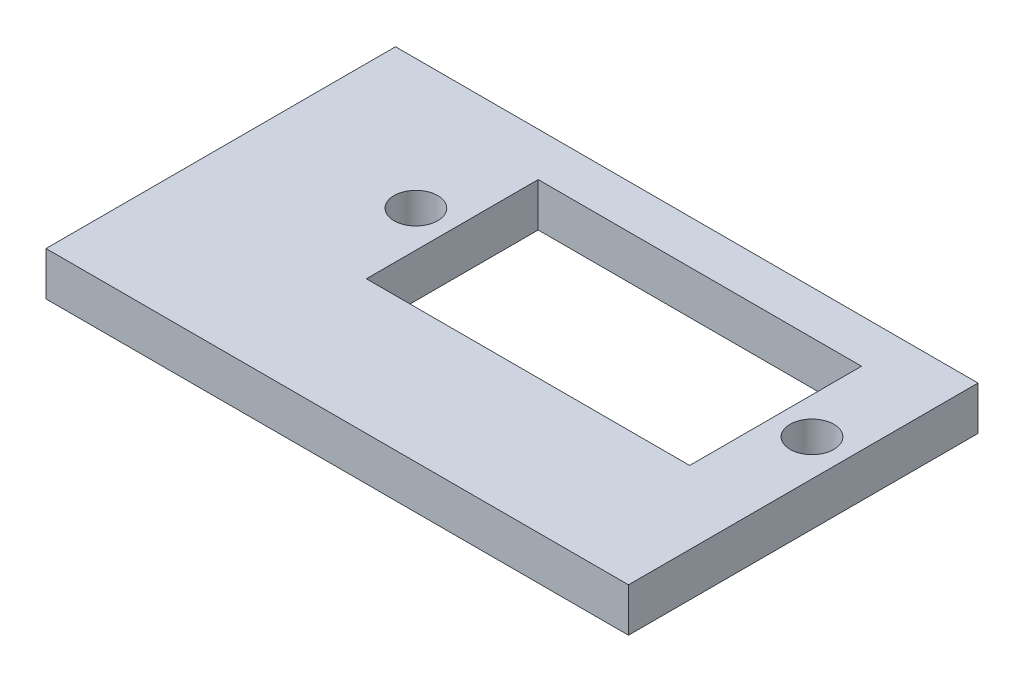
ISO-10303-21;
HEADER;
FILE_DESCRIPTION(('STEP AP214'),'2;1');
FILE_NAME('part.step','',(''),(''),'','','');
FILE_SCHEMA(('AUTOMOTIVE_DESIGN { 1 0 10303 214 1 1 1 1 }'));
ENDSEC;
DATA;
#1=APPLICATION_CONTEXT('core data for automotive mechanical design processes');
#2=APPLICATION_PROTOCOL_DEFINITION('international standard','automotive_design',2000,#1);
#3=PRODUCT_CONTEXT('',#1,'mechanical');
#4=PRODUCT('Part','Part','',(#3));
#5=PRODUCT_RELATED_PRODUCT_CATEGORY('part','',(#4));
#6=PRODUCT_DEFINITION_FORMATION('','',#4);
#7=PRODUCT_DEFINITION_CONTEXT('part definition',#1,'design');
#8=PRODUCT_DEFINITION('design','',#6,#7);
#9=PRODUCT_DEFINITION_SHAPE('','',#8);
#10=(LENGTH_UNIT() NAMED_UNIT(*) SI_UNIT(.MILLI.,.METRE.));
#11=(NAMED_UNIT(*) PLANE_ANGLE_UNIT() SI_UNIT($,.RADIAN.));
#12=(NAMED_UNIT(*) SI_UNIT($,.STERADIAN.) SOLID_ANGLE_UNIT());
#13=UNCERTAINTY_MEASURE_WITH_UNIT(LENGTH_MEASURE(1.E-05),#10,'distance_accuracy_value','');
#14=(GEOMETRIC_REPRESENTATION_CONTEXT(3) GLOBAL_UNCERTAINTY_ASSIGNED_CONTEXT((#13)) GLOBAL_UNIT_ASSIGNED_CONTEXT((#10,
#11,#12)) REPRESENTATION_CONTEXT('',''));
#15=CARTESIAN_POINT('',(0.,0.,0.));
#16=DIRECTION('',(0.,0.,1.));
#17=DIRECTION('',(1.,0.,0.));
#18=AXIS2_PLACEMENT_3D('',#15,#16,#17);
#19=CARTESIAN_POINT('',(0.,3.,0.));
#20=DIRECTION('',(1.,0.,0.));
#21=DIRECTION('',(0.,0.,-1.));
#22=AXIS2_PLACEMENT_3D('',#19,#20,#21);
#23=PLANE('',#22);
#24=DIRECTION('',(0.,0.,1.));
#25=VECTOR('',#24,1.);
#26=CARTESIAN_POINT('',(0.,0.,0.));
#27=LINE('',#26,#25);
#28=CARTESIAN_POINT('',(0.,0.,-24.));
#29=VERTEX_POINT('',#28);
#30=CARTESIAN_POINT('',(0.,0.,0.));
#31=VERTEX_POINT('',#30);
#32=EDGE_CURVE('E137',#29,#31,#27,.T.);
#33=ORIENTED_EDGE('',*,*,#32,.T.);
#34=DIRECTION('',(0.,-1.,0.));
#35=VECTOR('',#34,1.);
#36=CARTESIAN_POINT('',(0.,3.,0.));
#37=LINE('',#36,#35);
#38=CARTESIAN_POINT('',(0.,3.,0.));
#39=VERTEX_POINT('',#38);
#40=EDGE_CURVE('E154',#39,#31,#37,.T.);
#41=ORIENTED_EDGE('',*,*,#40,.F.);
#42=DIRECTION('',(0.,0.,1.));
#43=VECTOR('',#42,1.);
#44=CARTESIAN_POINT('',(0.,3.,0.));
#45=LINE('',#44,#43);
#46=CARTESIAN_POINT('',(0.,3.,-24.));
#47=VERTEX_POINT('',#46);
#48=EDGE_CURVE('E138',#47,#39,#45,.T.);
#49=ORIENTED_EDGE('',*,*,#48,.F.);
#50=DIRECTION('',(0.,1.,0.));
#51=VECTOR('',#50,1.);
#52=CARTESIAN_POINT('',(0.,3.,-24.));
#53=LINE('',#52,#51);
#54=EDGE_CURVE('E123',#29,#47,#53,.T.);
#55=ORIENTED_EDGE('',*,*,#54,.F.);
#56=EDGE_LOOP('',(#33,#41,#49,#55));
#57=FACE_BOUND('',#56,.T.);
#58=ADVANCED_FACE('F32',(#57),#23,.F.);
#59=CARTESIAN_POINT('',(0.,3.,0.));
#60=DIRECTION('',(0.,0.,-1.));
#61=DIRECTION('',(-1.,0.,0.));
#62=AXIS2_PLACEMENT_3D('',#59,#60,#61);
#63=PLANE('',#62);
#64=DIRECTION('',(1.,0.,0.));
#65=VECTOR('',#64,1.);
#66=CARTESIAN_POINT('',(0.,0.,0.));
#67=LINE('',#66,#65);
#68=CARTESIAN_POINT('',(40.,0.,0.));
#69=VERTEX_POINT('',#68);
#70=EDGE_CURVE('E149',#31,#69,#67,.T.);
#71=ORIENTED_EDGE('',*,*,#70,.T.);
#72=DIRECTION('',(0.,-1.,0.));
#73=VECTOR('',#72,1.);
#74=CARTESIAN_POINT('',(40.,3.,0.));
#75=LINE('',#74,#73);
#76=CARTESIAN_POINT('',(40.,3.,0.));
#77=VERTEX_POINT('',#76);
#78=EDGE_CURVE('E146',#77,#69,#75,.T.);
#79=ORIENTED_EDGE('',*,*,#78,.F.);
#80=DIRECTION('',(1.,0.,0.));
#81=VECTOR('',#80,1.);
#82=CARTESIAN_POINT('',(0.,3.,0.));
#83=LINE('',#82,#81);
#84=EDGE_CURVE('E141',#39,#77,#83,.T.);
#85=ORIENTED_EDGE('',*,*,#84,.F.);
#86=ORIENTED_EDGE('',*,*,#40,.T.);
#87=EDGE_LOOP('',(#71,#79,#85,#86));
#88=FACE_BOUND('',#87,.T.);
#89=ADVANCED_FACE('F190',(#88),#63,.F.);
#90=CARTESIAN_POINT('',(40.,3.,0.));
#91=DIRECTION('',(-1.,0.,0.));
#92=DIRECTION('',(0.,0.,1.));
#93=AXIS2_PLACEMENT_3D('',#90,#91,#92);
#94=PLANE('',#93);
#95=DIRECTION('',(0.,0.,-1.));
#96=VECTOR('',#95,1.);
#97=CARTESIAN_POINT('',(40.,0.,0.));
#98=LINE('',#97,#96);
#99=CARTESIAN_POINT('',(40.,0.,-24.));
#100=VERTEX_POINT('',#99);
#101=EDGE_CURVE('E142',#69,#100,#98,.T.);
#102=ORIENTED_EDGE('',*,*,#101,.T.);
#103=DIRECTION('',(0.,-1.,0.));
#104=VECTOR('',#103,1.);
#105=CARTESIAN_POINT('',(40.,3.,-24.));
#106=LINE('',#105,#104);
#107=CARTESIAN_POINT('',(40.,3.,-24.));
#108=VERTEX_POINT('',#107);
#109=EDGE_CURVE('E131',#108,#100,#106,.T.);
#110=ORIENTED_EDGE('',*,*,#109,.F.);
#111=DIRECTION('',(0.,0.,-1.));
#112=VECTOR('',#111,1.);
#113=CARTESIAN_POINT('',(40.,3.,0.));
#114=LINE('',#113,#112);
#115=EDGE_CURVE('E144',#77,#108,#114,.T.);
#116=ORIENTED_EDGE('',*,*,#115,.F.);
#117=ORIENTED_EDGE('',*,*,#78,.T.);
#118=EDGE_LOOP('',(#102,#110,#116,#117));
#119=FACE_BOUND('',#118,.T.);
#120=ADVANCED_FACE('F180',(#119),#94,.F.);
#121=CARTESIAN_POINT('',(0.,3.,0.));
#122=DIRECTION('',(0.,-1.,0.));
#123=DIRECTION('',(0.,0.,-1.));
#124=AXIS2_PLACEMENT_3D('',#121,#122,#123);
#125=PLANE('',#124);
#126=CARTESIAN_POINT('',(37.5,3.,-15.1));
#127=DIRECTION('',(0.,1.,0.));
#128=DIRECTION('',(0.,0.,1.));
#129=AXIS2_PLACEMENT_3D('',#126,#127,#128);
#130=CIRCLE('',#129,1.5);
#131=CARTESIAN_POINT('',(37.5,3.,-13.6));
#132=VERTEX_POINT('',#131);
#133=EDGE_CURVE('E170',#132,#132,#130,.T.);
#134=ORIENTED_EDGE('',*,*,#133,.F.);
#135=EDGE_LOOP('',(#134));
#136=FACE_BOUND('',#135,.T.);
#137=CARTESIAN_POINT('',(10.3,3.,-15.1));
#138=DIRECTION('',(0.,1.,0.));
#139=DIRECTION('',(0.,0.,1.));
#140=AXIS2_PLACEMENT_3D('',#137,#138,#139);
#141=CIRCLE('',#140,1.5);
#142=CARTESIAN_POINT('',(10.3,3.,-13.6));
#143=VERTEX_POINT('',#142);
#144=EDGE_CURVE('E162',#143,#143,#141,.T.);
#145=ORIENTED_EDGE('',*,*,#144,.F.);
#146=EDGE_LOOP('',(#145));
#147=FACE_BOUND('',#146,.T.);
#148=DIRECTION('',(-1.,0.,0.));
#149=VECTOR('',#148,1.);
#150=CARTESIAN_POINT('',(12.8,3.,-21.));
#151=LINE('',#150,#149);
#152=CARTESIAN_POINT('',(35.,3.,-21.));
#153=VERTEX_POINT('',#152);
#154=CARTESIAN_POINT('',(12.8,3.,-21.));
#155=VERTEX_POINT('',#154);
#156=EDGE_CURVE('E109',#153,#155,#151,.T.);
#157=ORIENTED_EDGE('',*,*,#156,.F.);
#158=DIRECTION('',(0.,0.,-1.));
#159=VECTOR('',#158,1.);
#160=CARTESIAN_POINT('',(35.,3.,-21.));
#161=LINE('',#160,#159);
#162=CARTESIAN_POINT('',(35.,3.,-9.2));
#163=VERTEX_POINT('',#162);
#164=EDGE_CURVE('E48',#163,#153,#161,.T.);
#165=ORIENTED_EDGE('',*,*,#164,.F.);
#166=DIRECTION('',(1.,0.,0.));
#167=VECTOR('',#166,1.);
#168=CARTESIAN_POINT('',(12.8,3.,-9.2));
#169=LINE('',#168,#167);
#170=CARTESIAN_POINT('',(12.8,3.,-9.2));
#171=VERTEX_POINT('',#170);
#172=EDGE_CURVE('E116',#171,#163,#169,.T.);
#173=ORIENTED_EDGE('',*,*,#172,.F.);
#174=DIRECTION('',(0.,0.,1.));
#175=VECTOR('',#174,1.);
#176=CARTESIAN_POINT('',(12.8,3.,-21.));
#177=LINE('',#176,#175);
#178=EDGE_CURVE('E100',#155,#171,#177,.T.);
#179=ORIENTED_EDGE('',*,*,#178,.F.);
#180=EDGE_LOOP('',(#157,#165,#173,#179));
#181=FACE_BOUND('',#180,.T.);
#182=ORIENTED_EDGE('',*,*,#48,.T.);
#183=ORIENTED_EDGE('',*,*,#84,.T.);
#184=ORIENTED_EDGE('',*,*,#115,.T.);
#185=DIRECTION('',(1.,0.,0.));
#186=VECTOR('',#185,1.);
#187=CARTESIAN_POINT('',(0.,3.,-24.));
#188=LINE('',#187,#186);
#189=EDGE_CURVE('E128',#47,#108,#188,.T.);
#190=ORIENTED_EDGE('',*,*,#189,.F.);
#191=EDGE_LOOP('',(#182,#183,#184,#190));
#192=FACE_BOUND('',#191,.T.);
#193=ADVANCED_FACE('F113',(#136,#147,#181,#192),#125,.F.);
#194=CARTESIAN_POINT('',(0.,0.,0.));
#195=DIRECTION('',(0.,-1.,0.));
#196=DIRECTION('',(0.,0.,-1.));
#197=AXIS2_PLACEMENT_3D('',#194,#195,#196);
#198=PLANE('',#197);
#199=CARTESIAN_POINT('',(37.5,0.,-15.1));
#200=DIRECTION('',(0.,-1.,0.));
#201=DIRECTION('',(0.,0.,-1.));
#202=AXIS2_PLACEMENT_3D('',#199,#200,#201);
#203=CIRCLE('',#202,1.5);
#204=CARTESIAN_POINT('',(37.5,0.,-16.6));
#205=VERTEX_POINT('',#204);
#206=EDGE_CURVE('E35',#205,#205,#203,.T.);
#207=ORIENTED_EDGE('',*,*,#206,.F.);
#208=EDGE_LOOP('',(#207));
#209=FACE_BOUND('',#208,.T.);
#210=CARTESIAN_POINT('',(10.3,0.,-15.1));
#211=DIRECTION('',(0.,-1.,0.));
#212=DIRECTION('',(0.,0.,-1.));
#213=AXIS2_PLACEMENT_3D('',#210,#211,#212);
#214=CIRCLE('',#213,1.5);
#215=CARTESIAN_POINT('',(10.3,0.,-16.6));
#216=VERTEX_POINT('',#215);
#217=EDGE_CURVE('E160',#216,#216,#214,.T.);
#218=ORIENTED_EDGE('',*,*,#217,.F.);
#219=EDGE_LOOP('',(#218));
#220=FACE_BOUND('',#219,.T.);
#221=DIRECTION('',(0.,0.,1.));
#222=VECTOR('',#221,1.);
#223=CARTESIAN_POINT('',(35.,0.,0.));
#224=LINE('',#223,#222);
#225=CARTESIAN_POINT('',(35.,0.,-21.));
#226=VERTEX_POINT('',#225);
#227=CARTESIAN_POINT('',(35.,0.,-9.2));
#228=VERTEX_POINT('',#227);
#229=EDGE_CURVE('E11',#226,#228,#224,.T.);
#230=ORIENTED_EDGE('',*,*,#229,.F.);
#231=DIRECTION('',(1.,0.,0.));
#232=VECTOR('',#231,1.);
#233=CARTESIAN_POINT('',(0.,0.,-21.));
#234=LINE('',#233,#232);
#235=CARTESIAN_POINT('',(12.8,0.,-21.));
#236=VERTEX_POINT('',#235);
#237=EDGE_CURVE('E157',#236,#226,#234,.T.);
#238=ORIENTED_EDGE('',*,*,#237,.F.);
#239=DIRECTION('',(0.,0.,-1.));
#240=VECTOR('',#239,1.);
#241=CARTESIAN_POINT('',(12.8,0.,0.));
#242=LINE('',#241,#240);
#243=CARTESIAN_POINT('',(12.8,0.,-9.2));
#244=VERTEX_POINT('',#243);
#245=EDGE_CURVE('E103',#244,#236,#242,.T.);
#246=ORIENTED_EDGE('',*,*,#245,.F.);
#247=DIRECTION('',(-1.,0.,0.));
#248=VECTOR('',#247,1.);
#249=CARTESIAN_POINT('',(0.,0.,-9.2));
#250=LINE('',#249,#248);
#251=EDGE_CURVE('E40',#228,#244,#250,.T.);
#252=ORIENTED_EDGE('',*,*,#251,.F.);
#253=EDGE_LOOP('',(#230,#238,#246,#252));
#254=FACE_BOUND('',#253,.T.);
#255=ORIENTED_EDGE('',*,*,#32,.F.);
#256=DIRECTION('',(-1.,0.,0.));
#257=VECTOR('',#256,1.);
#258=CARTESIAN_POINT('',(0.,0.,-24.));
#259=LINE('',#258,#257);
#260=EDGE_CURVE('E134',#100,#29,#259,.T.);
#261=ORIENTED_EDGE('',*,*,#260,.F.);
#262=ORIENTED_EDGE('',*,*,#101,.F.);
#263=ORIENTED_EDGE('',*,*,#70,.F.);
#264=EDGE_LOOP('',(#255,#261,#262,#263));
#265=FACE_BOUND('',#264,.T.);
#266=ADVANCED_FACE('F179',(#209,#220,#254,#265),#198,.T.);
#267=CARTESIAN_POINT('',(0.,0.,-24.));
#268=DIRECTION('',(0.,0.,1.));
#269=DIRECTION('',(1.,0.,0.));
#270=AXIS2_PLACEMENT_3D('',#267,#268,#269);
#271=PLANE('',#270);
#272=ORIENTED_EDGE('',*,*,#54,.T.);
#273=ORIENTED_EDGE('',*,*,#189,.T.);
#274=ORIENTED_EDGE('',*,*,#109,.T.);
#275=ORIENTED_EDGE('',*,*,#260,.T.);
#276=EDGE_LOOP('',(#272,#273,#274,#275));
#277=FACE_BOUND('',#276,.T.);
#278=ADVANCED_FACE('F186',(#277),#271,.F.);
#279=CARTESIAN_POINT('',(35.,-7.,-21.));
#280=DIRECTION('',(1.,0.,0.));
#281=DIRECTION('',(0.,0.,-1.));
#282=AXIS2_PLACEMENT_3D('',#279,#280,#281);
#283=PLANE('',#282);
#284=ORIENTED_EDGE('',*,*,#229,.T.);
#285=DIRECTION('',(0.,1.,0.));
#286=VECTOR('',#285,1.);
#287=CARTESIAN_POINT('',(35.,-7.,-9.2));
#288=LINE('',#287,#286);
#289=EDGE_CURVE('E121',#228,#163,#288,.T.);
#290=ORIENTED_EDGE('',*,*,#289,.T.);
#291=ORIENTED_EDGE('',*,*,#164,.T.);
#292=DIRECTION('',(0.,1.,0.));
#293=VECTOR('',#292,1.);
#294=CARTESIAN_POINT('',(35.,-7.,-21.));
#295=LINE('',#294,#293);
#296=EDGE_CURVE('E106',#226,#153,#295,.T.);
#297=ORIENTED_EDGE('',*,*,#296,.F.);
#298=EDGE_LOOP('',(#284,#290,#291,#297));
#299=FACE_BOUND('',#298,.T.);
#300=ADVANCED_FACE('F211',(#299),#283,.F.);
#301=CARTESIAN_POINT('',(12.8,-7.,-9.2));
#302=DIRECTION('',(0.,0.,1.));
#303=DIRECTION('',(1.,0.,0.));
#304=AXIS2_PLACEMENT_3D('',#301,#302,#303);
#305=PLANE('',#304);
#306=ORIENTED_EDGE('',*,*,#251,.T.);
#307=DIRECTION('',(0.,1.,0.));
#308=VECTOR('',#307,1.);
#309=CARTESIAN_POINT('',(12.8,-7.,-9.2));
#310=LINE('',#309,#308);
#311=EDGE_CURVE('E105',#244,#171,#310,.T.);
#312=ORIENTED_EDGE('',*,*,#311,.T.);
#313=ORIENTED_EDGE('',*,*,#172,.T.);
#314=ORIENTED_EDGE('',*,*,#289,.F.);
#315=EDGE_LOOP('',(#306,#312,#313,#314));
#316=FACE_BOUND('',#315,.T.);
#317=ADVANCED_FACE('F216',(#316),#305,.F.);
#318=CARTESIAN_POINT('',(12.8,-7.,-21.));
#319=DIRECTION('',(-1.,0.,0.));
#320=DIRECTION('',(0.,0.,1.));
#321=AXIS2_PLACEMENT_3D('',#318,#319,#320);
#322=PLANE('',#321);
#323=ORIENTED_EDGE('',*,*,#245,.T.);
#324=DIRECTION('',(0.,1.,0.));
#325=VECTOR('',#324,1.);
#326=CARTESIAN_POINT('',(12.8,-7.,-21.));
#327=LINE('',#326,#325);
#328=EDGE_CURVE('E56',#236,#155,#327,.T.);
#329=ORIENTED_EDGE('',*,*,#328,.T.);
#330=ORIENTED_EDGE('',*,*,#178,.T.);
#331=ORIENTED_EDGE('',*,*,#311,.F.);
#332=EDGE_LOOP('',(#323,#329,#330,#331));
#333=FACE_BOUND('',#332,.T.);
#334=ADVANCED_FACE('F97',(#333),#322,.F.);
#335=CARTESIAN_POINT('',(12.8,-7.,-21.));
#336=DIRECTION('',(0.,0.,-1.));
#337=DIRECTION('',(-1.,0.,0.));
#338=AXIS2_PLACEMENT_3D('',#335,#336,#337);
#339=PLANE('',#338);
#340=ORIENTED_EDGE('',*,*,#237,.T.);
#341=ORIENTED_EDGE('',*,*,#296,.T.);
#342=ORIENTED_EDGE('',*,*,#156,.T.);
#343=ORIENTED_EDGE('',*,*,#328,.F.);
#344=EDGE_LOOP('',(#340,#341,#342,#343));
#345=FACE_BOUND('',#344,.T.);
#346=ADVANCED_FACE('F110',(#345),#339,.F.);
#347=CARTESIAN_POINT('',(10.3,-7.,-15.1));
#348=DIRECTION('',(0.,1.,0.));
#349=DIRECTION('',(0.,0.,1.));
#350=AXIS2_PLACEMENT_3D('',#347,#348,#349);
#351=CYLINDRICAL_SURFACE('',#350,1.5);
#352=ORIENTED_EDGE('',*,*,#217,.T.);
#353=EDGE_LOOP('',(#352));
#354=FACE_BOUND('',#353,.T.);
#355=ORIENTED_EDGE('',*,*,#144,.T.);
#356=EDGE_LOOP('',(#355));
#357=FACE_BOUND('',#356,.T.);
#358=ADVANCED_FACE('F221',(#354,#357),#351,.F.);
#359=CARTESIAN_POINT('',(37.5,-7.,-15.1));
#360=DIRECTION('',(0.,1.,0.));
#361=DIRECTION('',(0.,0.,1.));
#362=AXIS2_PLACEMENT_3D('',#359,#360,#361);
#363=CYLINDRICAL_SURFACE('',#362,1.5);
#364=ORIENTED_EDGE('',*,*,#206,.T.);
#365=EDGE_LOOP('',(#364));
#366=FACE_BOUND('',#365,.T.);
#367=ORIENTED_EDGE('',*,*,#133,.T.);
#368=EDGE_LOOP('',(#367));
#369=FACE_BOUND('',#368,.T.);
#370=ADVANCED_FACE('F175',(#366,#369),#363,.F.);
#371=CLOSED_SHELL('',(#58,#89,#120,#193,#266,#278,#300,#317,#334,#346,#358,#370));
#372=MANIFOLD_SOLID_BREP('B2',#371);
#373=ADVANCED_BREP_SHAPE_REPRESENTATION('',(#18,#372),#14);
#374=SHAPE_DEFINITION_REPRESENTATION(#9,#373);
ENDSEC;
END-ISO-10303-21;
